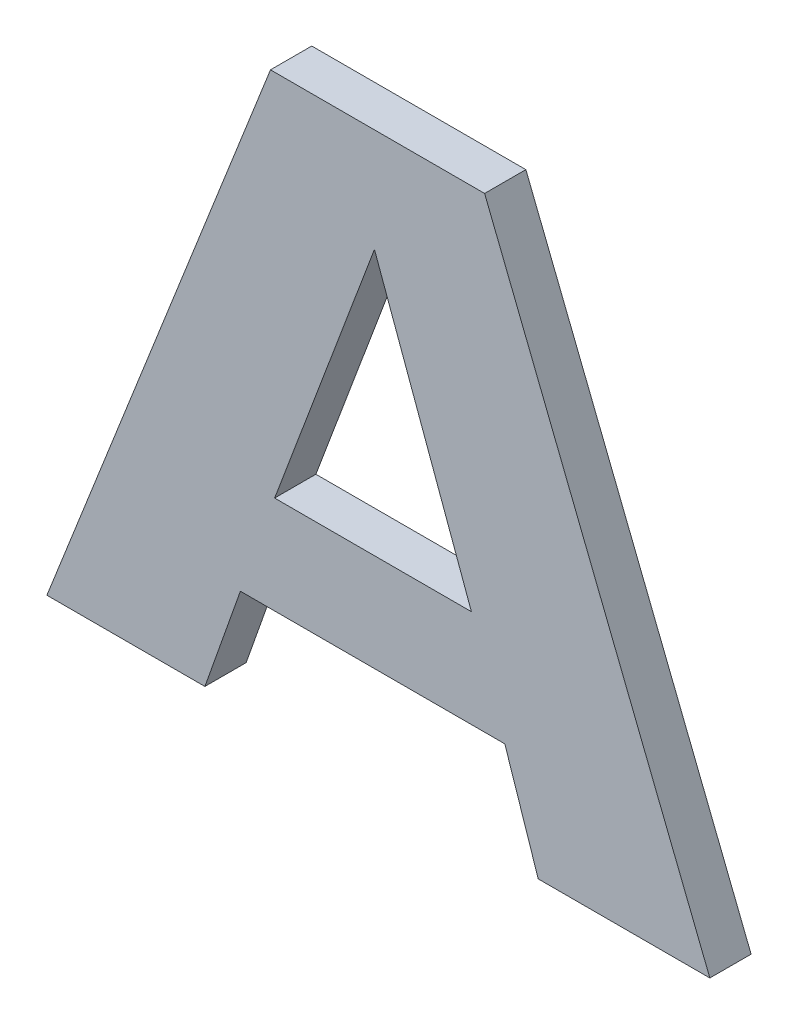
ISO-10303-21;
HEADER;
FILE_DESCRIPTION(('STEP AP214'),'2;1');
FILE_NAME('part.step','',(''),(''),'','','');
FILE_SCHEMA(('AUTOMOTIVE_DESIGN { 1 0 10303 214 1 1 1 1 }'));
ENDSEC;
DATA;
#1=APPLICATION_CONTEXT('core data for automotive mechanical design processes');
#2=APPLICATION_PROTOCOL_DEFINITION('international standard','automotive_design',2000,#1);
#3=PRODUCT_CONTEXT('',#1,'mechanical');
#4=PRODUCT('Part','Part','',(#3));
#5=PRODUCT_RELATED_PRODUCT_CATEGORY('part','',(#4));
#6=PRODUCT_DEFINITION_FORMATION('','',#4);
#7=PRODUCT_DEFINITION_CONTEXT('part definition',#1,'design');
#8=PRODUCT_DEFINITION('design','',#6,#7);
#9=PRODUCT_DEFINITION_SHAPE('','',#8);
#10=(LENGTH_UNIT() NAMED_UNIT(*) SI_UNIT(.MILLI.,.METRE.));
#11=(NAMED_UNIT(*) PLANE_ANGLE_UNIT() SI_UNIT($,.RADIAN.));
#12=(NAMED_UNIT(*) SI_UNIT($,.STERADIAN.) SOLID_ANGLE_UNIT());
#13=UNCERTAINTY_MEASURE_WITH_UNIT(LENGTH_MEASURE(1.E-05),#10,'distance_accuracy_value','');
#14=(GEOMETRIC_REPRESENTATION_CONTEXT(3) GLOBAL_UNCERTAINTY_ASSIGNED_CONTEXT((#13)) GLOBAL_UNIT_ASSIGNED_CONTEXT((#10,
#11,#12)) REPRESENTATION_CONTEXT('',''));
#15=CARTESIAN_POINT('',(0.,0.,0.));
#16=DIRECTION('',(0.,0.,1.));
#17=DIRECTION('',(1.,0.,0.));
#18=AXIS2_PLACEMENT_3D('',#15,#16,#17);
#19=CARTESIAN_POINT('',(0.,0.,0.1));
#20=DIRECTION('',(0.,0.,1.));
#21=DIRECTION('',(1.,0.,0.));
#22=AXIS2_PLACEMENT_3D('',#19,#20,#21);
#23=PLANE('',#22);
#24=DIRECTION('',(0.352239767666315,0.935909795906839,0.));
#25=VECTOR('',#24,1.);
#26=CARTESIAN_POINT('',(2.535,-2.332,0.1));
#27=LINE('',#26,#25);
#28=CARTESIAN_POINT('',(2.777,-1.689,0.1));
#29=VERTEX_POINT('',#28);
#30=CARTESIAN_POINT('',(2.535,-2.332,0.1));
#31=VERTEX_POINT('',#30);
#32=EDGE_CURVE('E153',#29,#31,#27,.F.);
#33=ORIENTED_EDGE('',*,*,#32,.F.);
#34=DIRECTION('',(0.343267298033595,-0.939237755896086,0.));
#35=VECTOR('',#34,1.);
#36=CARTESIAN_POINT('',(2.777,-1.689,0.1));
#37=LINE('',#36,#35);
#38=CARTESIAN_POINT('',(3.01200000000001,-2.332,0.1));
#39=VERTEX_POINT('',#38);
#40=EDGE_CURVE('E144',#39,#29,#37,.F.);
#41=ORIENTED_EDGE('',*,*,#40,.F.);
#42=DIRECTION('',(1.,0.,0.));
#43=VECTOR('',#42,1.);
#44=CARTESIAN_POINT('',(3.012,-2.332,0.1));
#45=LINE('',#44,#43);
#46=EDGE_CURVE('E146',#31,#39,#45,.T.);
#47=ORIENTED_EDGE('',*,*,#46,.F.);
#48=EDGE_LOOP('',(#33,#41,#47));
#49=FACE_BOUND('',#48,.T.);
#50=DIRECTION('',(-0.369290689635494,0.929313933258585,0.));
#51=VECTOR('',#50,1.);
#52=CARTESIAN_POINT('',(3.59,-2.812,0.1));
#53=LINE('',#52,#51);
#54=CARTESIAN_POINT('',(3.044,-1.438,0.1));
#55=VERTEX_POINT('',#54);
#56=CARTESIAN_POINT('',(3.59,-2.812,0.1));
#57=VERTEX_POINT('',#56);
#58=EDGE_CURVE('E112',#55,#57,#53,.F.);
#59=ORIENTED_EDGE('',*,*,#58,.F.);
#60=DIRECTION('',(1.,0.,0.));
#61=VECTOR('',#60,1.);
#62=CARTESIAN_POINT('',(3.044,-1.438,0.1));
#63=LINE('',#62,#61);
#64=CARTESIAN_POINT('',(2.525,-1.438,0.1));
#65=VERTEX_POINT('',#64);
#66=EDGE_CURVE('E20',#65,#55,#63,.T.);
#67=ORIENTED_EDGE('',*,*,#66,.F.);
#68=DIRECTION('',(-0.366950718736308,-0.93024038292202,0.));
#69=VECTOR('',#68,1.);
#70=CARTESIAN_POINT('',(2.525,-1.438,0.1));
#71=LINE('',#70,#69);
#72=CARTESIAN_POINT('',(1.98300000000001,-2.812,0.1));
#73=VERTEX_POINT('',#72);
#74=EDGE_CURVE('E101',#73,#65,#71,.F.);
#75=ORIENTED_EDGE('',*,*,#74,.F.);
#76=DIRECTION('',(1.,0.,0.));
#77=VECTOR('',#76,1.);
#78=CARTESIAN_POINT('',(1.983,-2.812,0.1));
#79=LINE('',#78,#77);
#80=CARTESIAN_POINT('',(2.366,-2.812,0.1));
#81=VERTEX_POINT('',#80);
#82=EDGE_CURVE('E96',#81,#73,#79,.F.);
#83=ORIENTED_EDGE('',*,*,#82,.F.);
#84=DIRECTION('',(0.333631692293696,0.942703502643989,0.));
#85=VECTOR('',#84,1.);
#86=CARTESIAN_POINT('',(2.366,-2.812,0.1));
#87=LINE('',#86,#85);
#88=CARTESIAN_POINT('',(2.452,-2.569,0.1));
#89=VERTEX_POINT('',#88);
#90=EDGE_CURVE('E123',#89,#81,#87,.F.);
#91=ORIENTED_EDGE('',*,*,#90,.F.);
#92=DIRECTION('',(1.,0.,0.));
#93=VECTOR('',#92,1.);
#94=CARTESIAN_POINT('',(2.452,-2.569,0.1));
#95=LINE('',#94,#93);
#96=CARTESIAN_POINT('',(3.093,-2.569,0.1));
#97=VERTEX_POINT('',#96);
#98=EDGE_CURVE('E127',#97,#89,#95,.F.);
#99=ORIENTED_EDGE('',*,*,#98,.F.);
#100=DIRECTION('',(0.316227766016808,-0.948683298050524,0.));
#101=VECTOR('',#100,1.);
#102=CARTESIAN_POINT('',(3.093,-2.569,0.1));
#103=LINE('',#102,#101);
#104=CARTESIAN_POINT('',(3.174,-2.812,0.1));
#105=VERTEX_POINT('',#104);
#106=EDGE_CURVE('E131',#105,#97,#103,.F.);
#107=ORIENTED_EDGE('',*,*,#106,.F.);
#108=DIRECTION('',(1.,0.,0.));
#109=VECTOR('',#108,1.);
#110=CARTESIAN_POINT('',(3.174,-2.812,0.1));
#111=LINE('',#110,#109);
#112=EDGE_CURVE('E135',#57,#105,#111,.F.);
#113=ORIENTED_EDGE('',*,*,#112,.F.);
#114=EDGE_LOOP('',(#59,#67,#75,#83,#91,#99,#107,#113));
#115=FACE_BOUND('',#114,.T.);
#116=ADVANCED_FACE('F17',(#49,#115),#23,.T.);
#117=CARTESIAN_POINT('',(3.044,-1.438,0.));
#118=DIRECTION('',(0.,1.,0.));
#119=DIRECTION('',(0.,0.,1.));
#120=AXIS2_PLACEMENT_3D('',#117,#118,#119);
#121=PLANE('',#120);
#122=DIRECTION('',(0.,0.,1.));
#123=VECTOR('',#122,1.);
#124=CARTESIAN_POINT('',(3.04400000000002,-1.43799999999999,0.));
#125=LINE('',#124,#123);
#126=CARTESIAN_POINT('',(3.044,-1.438,0.));
#127=VERTEX_POINT('',#126);
#128=EDGE_CURVE('E139',#127,#55,#125,.T.);
#129=ORIENTED_EDGE('',*,*,#128,.F.);
#130=DIRECTION('',(1.,0.,0.));
#131=VECTOR('',#130,1.);
#132=CARTESIAN_POINT('',(0.,-1.438,0.));
#133=LINE('',#132,#131);
#134=CARTESIAN_POINT('',(2.525,-1.438,0.));
#135=VERTEX_POINT('',#134);
#136=EDGE_CURVE('E118',#127,#135,#133,.F.);
#137=ORIENTED_EDGE('',*,*,#136,.T.);
#138=DIRECTION('',(0.,0.,1.));
#139=VECTOR('',#138,1.);
#140=CARTESIAN_POINT('',(2.525,-1.438,0.));
#141=LINE('',#140,#139);
#142=EDGE_CURVE('E106',#65,#135,#141,.F.);
#143=ORIENTED_EDGE('',*,*,#142,.F.);
#144=ORIENTED_EDGE('',*,*,#66,.T.);
#145=EDGE_LOOP('',(#129,#137,#143,#144));
#146=FACE_BOUND('',#145,.T.);
#147=ADVANCED_FACE('F117',(#146),#121,.T.);
#148=CARTESIAN_POINT('',(2.525,-1.438,0.));
#149=DIRECTION('',(-0.93024038292202,0.366950718736308,0.));
#150=DIRECTION('',(-0.366950718736308,-0.93024038292202,0.));
#151=AXIS2_PLACEMENT_3D('',#148,#149,#150);
#152=PLANE('',#151);
#153=ORIENTED_EDGE('',*,*,#142,.T.);
#154=DIRECTION('',(-0.366950718736338,-0.930240382922009,0.));
#155=VECTOR('',#154,1.);
#156=CARTESIAN_POINT('',(2.525,-1.438,0.));
#157=LINE('',#156,#155);
#158=CARTESIAN_POINT('',(1.98300000000002,-2.81200000000001,0.));
#159=VERTEX_POINT('',#158);
#160=EDGE_CURVE('E157',#135,#159,#157,.T.);
#161=ORIENTED_EDGE('',*,*,#160,.T.);
#162=DIRECTION('',(0.,0.,-1.));
#163=VECTOR('',#162,1.);
#164=CARTESIAN_POINT('',(1.983,-2.812,0.));
#165=LINE('',#164,#163);
#166=EDGE_CURVE('E108',#73,#159,#165,.T.);
#167=ORIENTED_EDGE('',*,*,#166,.F.);
#168=ORIENTED_EDGE('',*,*,#74,.T.);
#169=EDGE_LOOP('',(#153,#161,#167,#168));
#170=FACE_BOUND('',#169,.T.);
#171=ADVANCED_FACE('F103',(#170),#152,.T.);
#172=CARTESIAN_POINT('',(1.983,-2.812,0.));
#173=DIRECTION('',(0.,-1.,0.));
#174=DIRECTION('',(0.,0.,-1.));
#175=AXIS2_PLACEMENT_3D('',#172,#173,#174);
#176=PLANE('',#175);
#177=ORIENTED_EDGE('',*,*,#166,.T.);
#178=DIRECTION('',(1.,0.,0.));
#179=VECTOR('',#178,1.);
#180=CARTESIAN_POINT('',(0.,-2.812,0.));
#181=LINE('',#180,#179);
#182=CARTESIAN_POINT('',(2.366,-2.812,0.));
#183=VERTEX_POINT('',#182);
#184=EDGE_CURVE('E159',#159,#183,#181,.T.);
#185=ORIENTED_EDGE('',*,*,#184,.T.);
#186=DIRECTION('',(0.,0.,1.));
#187=VECTOR('',#186,1.);
#188=CARTESIAN_POINT('',(2.366,-2.812,0.));
#189=LINE('',#188,#187);
#190=EDGE_CURVE('E125',#81,#183,#189,.F.);
#191=ORIENTED_EDGE('',*,*,#190,.F.);
#192=ORIENTED_EDGE('',*,*,#82,.T.);
#193=EDGE_LOOP('',(#177,#185,#191,#192));
#194=FACE_BOUND('',#193,.T.);
#195=ADVANCED_FACE('F225',(#194),#176,.T.);
#196=CARTESIAN_POINT('',(2.366,-2.812,0.));
#197=DIRECTION('',(0.942703502643989,-0.333631692293696,0.));
#198=DIRECTION('',(0.333631692293696,0.942703502643989,0.));
#199=AXIS2_PLACEMENT_3D('',#196,#197,#198);
#200=PLANE('',#199);
#201=ORIENTED_EDGE('',*,*,#190,.T.);
#202=DIRECTION('',(0.333631692293751,0.942703502643969,0.));
#203=VECTOR('',#202,1.);
#204=CARTESIAN_POINT('',(2.366,-2.812,0.));
#205=LINE('',#204,#203);
#206=CARTESIAN_POINT('',(2.45199999999999,-2.569,0.));
#207=VERTEX_POINT('',#206);
#208=EDGE_CURVE('E162',#183,#207,#205,.T.);
#209=ORIENTED_EDGE('',*,*,#208,.T.);
#210=DIRECTION('',(0.,0.,-1.));
#211=VECTOR('',#210,1.);
#212=CARTESIAN_POINT('',(2.452,-2.569,0.));
#213=LINE('',#212,#211);
#214=EDGE_CURVE('E129',#89,#207,#213,.T.);
#215=ORIENTED_EDGE('',*,*,#214,.F.);
#216=ORIENTED_EDGE('',*,*,#90,.T.);
#217=EDGE_LOOP('',(#201,#209,#215,#216));
#218=FACE_BOUND('',#217,.T.);
#219=ADVANCED_FACE('F221',(#218),#200,.T.);
#220=CARTESIAN_POINT('',(2.452,-2.569,0.));
#221=DIRECTION('',(0.,-1.,0.));
#222=DIRECTION('',(0.,0.,-1.));
#223=AXIS2_PLACEMENT_3D('',#220,#221,#222);
#224=PLANE('',#223);
#225=ORIENTED_EDGE('',*,*,#214,.T.);
#226=DIRECTION('',(1.,0.,0.));
#227=VECTOR('',#226,1.);
#228=CARTESIAN_POINT('',(0.,-2.569,0.));
#229=LINE('',#228,#227);
#230=CARTESIAN_POINT('',(3.093,-2.569,0.));
#231=VERTEX_POINT('',#230);
#232=EDGE_CURVE('E165',#207,#231,#229,.T.);
#233=ORIENTED_EDGE('',*,*,#232,.T.);
#234=DIRECTION('',(0.,0.,1.));
#235=VECTOR('',#234,1.);
#236=CARTESIAN_POINT('',(3.093,-2.569,0.));
#237=LINE('',#236,#235);
#238=EDGE_CURVE('E133',#97,#231,#237,.F.);
#239=ORIENTED_EDGE('',*,*,#238,.F.);
#240=ORIENTED_EDGE('',*,*,#98,.T.);
#241=EDGE_LOOP('',(#225,#233,#239,#240));
#242=FACE_BOUND('',#241,.T.);
#243=ADVANCED_FACE('F217',(#242),#224,.T.);
#244=CARTESIAN_POINT('',(3.093,-2.569,0.));
#245=DIRECTION('',(-0.948683298050524,-0.316227766016808,0.));
#246=DIRECTION('',(0.316227766016808,-0.948683298050524,0.));
#247=AXIS2_PLACEMENT_3D('',#244,#245,#246);
#248=PLANE('',#247);
#249=ORIENTED_EDGE('',*,*,#238,.T.);
#250=DIRECTION('',(0.316227766016839,-0.948683298050513,0.));
#251=VECTOR('',#250,1.);
#252=CARTESIAN_POINT('',(3.093,-2.569,0.));
#253=LINE('',#252,#251);
#254=CARTESIAN_POINT('',(3.174,-2.812,0.));
#255=VERTEX_POINT('',#254);
#256=EDGE_CURVE('E168',#231,#255,#253,.T.);
#257=ORIENTED_EDGE('',*,*,#256,.T.);
#258=DIRECTION('',(0.,0.,-1.));
#259=VECTOR('',#258,1.);
#260=CARTESIAN_POINT('',(3.174,-2.812,0.));
#261=LINE('',#260,#259);
#262=EDGE_CURVE('E137',#105,#255,#261,.T.);
#263=ORIENTED_EDGE('',*,*,#262,.F.);
#264=ORIENTED_EDGE('',*,*,#106,.T.);
#265=EDGE_LOOP('',(#249,#257,#263,#264));
#266=FACE_BOUND('',#265,.T.);
#267=ADVANCED_FACE('F213',(#266),#248,.T.);
#268=CARTESIAN_POINT('',(3.174,-2.812,0.));
#269=DIRECTION('',(0.,-1.,0.));
#270=DIRECTION('',(0.,0.,-1.));
#271=AXIS2_PLACEMENT_3D('',#268,#269,#270);
#272=PLANE('',#271);
#273=ORIENTED_EDGE('',*,*,#262,.T.);
#274=DIRECTION('',(1.,0.,0.));
#275=VECTOR('',#274,1.);
#276=CARTESIAN_POINT('',(0.,-2.812,0.));
#277=LINE('',#276,#275);
#278=CARTESIAN_POINT('',(3.59,-2.812,0.));
#279=VERTEX_POINT('',#278);
#280=EDGE_CURVE('E171',#255,#279,#277,.T.);
#281=ORIENTED_EDGE('',*,*,#280,.T.);
#282=DIRECTION('',(0.,0.,1.));
#283=VECTOR('',#282,1.);
#284=CARTESIAN_POINT('',(3.59,-2.812,0.));
#285=LINE('',#284,#283);
#286=EDGE_CURVE('E142',#57,#279,#285,.F.);
#287=ORIENTED_EDGE('',*,*,#286,.F.);
#288=ORIENTED_EDGE('',*,*,#112,.T.);
#289=EDGE_LOOP('',(#273,#281,#287,#288));
#290=FACE_BOUND('',#289,.T.);
#291=ADVANCED_FACE('F209',(#290),#272,.T.);
#292=CARTESIAN_POINT('',(3.59,-2.812,0.));
#293=DIRECTION('',(0.929313933258585,0.369290689635494,0.));
#294=DIRECTION('',(-0.369290689635494,0.929313933258585,0.));
#295=AXIS2_PLACEMENT_3D('',#292,#293,#294);
#296=PLANE('',#295);
#297=ORIENTED_EDGE('',*,*,#286,.T.);
#298=DIRECTION('',(-0.369290689635505,0.92931393325858,0.));
#299=VECTOR('',#298,1.);
#300=CARTESIAN_POINT('',(3.59,-2.812,0.));
#301=LINE('',#300,#299);
#302=EDGE_CURVE('E174',#279,#127,#301,.T.);
#303=ORIENTED_EDGE('',*,*,#302,.T.);
#304=ORIENTED_EDGE('',*,*,#128,.T.);
#305=ORIENTED_EDGE('',*,*,#58,.T.);
#306=EDGE_LOOP('',(#297,#303,#304,#305));
#307=FACE_BOUND('',#306,.T.);
#308=ADVANCED_FACE('F206',(#307),#296,.T.);
#309=CARTESIAN_POINT('',(2.777,-1.689,0.));
#310=DIRECTION('',(-0.939237755896086,-0.343267298033595,0.));
#311=DIRECTION('',(0.343267298033595,-0.939237755896086,0.));
#312=AXIS2_PLACEMENT_3D('',#309,#310,#311);
#313=PLANE('',#312);
#314=DIRECTION('',(0.,0.,1.));
#315=VECTOR('',#314,1.);
#316=CARTESIAN_POINT('',(2.77699999999999,-1.68899999999999,0.));
#317=LINE('',#316,#315);
#318=CARTESIAN_POINT('',(2.777,-1.689,0.));
#319=VERTEX_POINT('',#318);
#320=EDGE_CURVE('E150',#319,#29,#317,.T.);
#321=ORIENTED_EDGE('',*,*,#320,.F.);
#322=DIRECTION('',(0.343267298033565,-0.939237755896097,0.));
#323=VECTOR('',#322,1.);
#324=CARTESIAN_POINT('',(2.777,-1.689,0.));
#325=LINE('',#324,#323);
#326=CARTESIAN_POINT('',(3.01200000000001,-2.332,0.));
#327=VERTEX_POINT('',#326);
#328=EDGE_CURVE('E177',#319,#327,#325,.T.);
#329=ORIENTED_EDGE('',*,*,#328,.T.);
#330=DIRECTION('',(0.,0.,1.));
#331=VECTOR('',#330,1.);
#332=CARTESIAN_POINT('',(3.012,-2.332,0.));
#333=LINE('',#332,#331);
#334=EDGE_CURVE('E148',#39,#327,#333,.F.);
#335=ORIENTED_EDGE('',*,*,#334,.F.);
#336=ORIENTED_EDGE('',*,*,#40,.T.);
#337=EDGE_LOOP('',(#321,#329,#335,#336));
#338=FACE_BOUND('',#337,.T.);
#339=ADVANCED_FACE('F190',(#338),#313,.T.);
#340=CARTESIAN_POINT('',(3.012,-2.332,0.));
#341=DIRECTION('',(0.,1.,0.));
#342=DIRECTION('',(0.,0.,1.));
#343=AXIS2_PLACEMENT_3D('',#340,#341,#342);
#344=PLANE('',#343);
#345=ORIENTED_EDGE('',*,*,#334,.T.);
#346=DIRECTION('',(1.,0.,0.));
#347=VECTOR('',#346,1.);
#348=CARTESIAN_POINT('',(0.,-2.332,0.));
#349=LINE('',#348,#347);
#350=CARTESIAN_POINT('',(2.535,-2.332,0.));
#351=VERTEX_POINT('',#350);
#352=EDGE_CURVE('E26',#327,#351,#349,.F.);
#353=ORIENTED_EDGE('',*,*,#352,.T.);
#354=DIRECTION('',(0.,0.,1.));
#355=VECTOR('',#354,1.);
#356=CARTESIAN_POINT('',(2.535,-2.332,0.));
#357=LINE('',#356,#355);
#358=EDGE_CURVE('E34',#31,#351,#357,.F.);
#359=ORIENTED_EDGE('',*,*,#358,.F.);
#360=ORIENTED_EDGE('',*,*,#46,.T.);
#361=EDGE_LOOP('',(#345,#353,#359,#360));
#362=FACE_BOUND('',#361,.T.);
#363=ADVANCED_FACE('F183',(#362),#344,.T.);
#364=CARTESIAN_POINT('',(2.535,-2.332,0.));
#365=DIRECTION('',(0.935909795906839,-0.352239767666315,0.));
#366=DIRECTION('',(0.352239767666315,0.935909795906839,0.));
#367=AXIS2_PLACEMENT_3D('',#364,#365,#366);
#368=PLANE('',#367);
#369=ORIENTED_EDGE('',*,*,#358,.T.);
#370=DIRECTION('',(0.352239767666335,0.935909795906831,0.));
#371=VECTOR('',#370,1.);
#372=CARTESIAN_POINT('',(2.535,-2.332,0.));
#373=LINE('',#372,#371);
#374=EDGE_CURVE('E11',#351,#319,#373,.T.);
#375=ORIENTED_EDGE('',*,*,#374,.T.);
#376=ORIENTED_EDGE('',*,*,#320,.T.);
#377=ORIENTED_EDGE('',*,*,#32,.T.);
#378=EDGE_LOOP('',(#369,#375,#376,#377));
#379=FACE_BOUND('',#378,.T.);
#380=ADVANCED_FACE('F193',(#379),#368,.T.);
#381=CARTESIAN_POINT('',(0.,0.,0.));
#382=DIRECTION('',(0.,0.,1.));
#383=DIRECTION('',(1.,0.,0.));
#384=AXIS2_PLACEMENT_3D('',#381,#382,#383);
#385=PLANE('',#384);
#386=ORIENTED_EDGE('',*,*,#352,.F.);
#387=ORIENTED_EDGE('',*,*,#328,.F.);
#388=ORIENTED_EDGE('',*,*,#374,.F.);
#389=EDGE_LOOP('',(#386,#387,#388));
#390=FACE_BOUND('',#389,.T.);
#391=ORIENTED_EDGE('',*,*,#280,.F.);
#392=ORIENTED_EDGE('',*,*,#256,.F.);
#393=ORIENTED_EDGE('',*,*,#232,.F.);
#394=ORIENTED_EDGE('',*,*,#208,.F.);
#395=ORIENTED_EDGE('',*,*,#184,.F.);
#396=ORIENTED_EDGE('',*,*,#160,.F.);
#397=ORIENTED_EDGE('',*,*,#136,.F.);
#398=ORIENTED_EDGE('',*,*,#302,.F.);
#399=EDGE_LOOP('',(#391,#392,#393,#394,#395,#396,#397,#398));
#400=FACE_BOUND('',#399,.T.);
#401=ADVANCED_FACE('F186',(#390,#400),#385,.F.);
#402=CLOSED_SHELL('',(#116,#147,#171,#195,#219,#243,#267,#291,#308,#339,#363,#380,#401));
#403=MANIFOLD_SOLID_BREP('B1',#402);
#404=ADVANCED_BREP_SHAPE_REPRESENTATION('',(#18,#403),#14);
#405=SHAPE_DEFINITION_REPRESENTATION(#9,#404);
ENDSEC;
END-ISO-10303-21;
